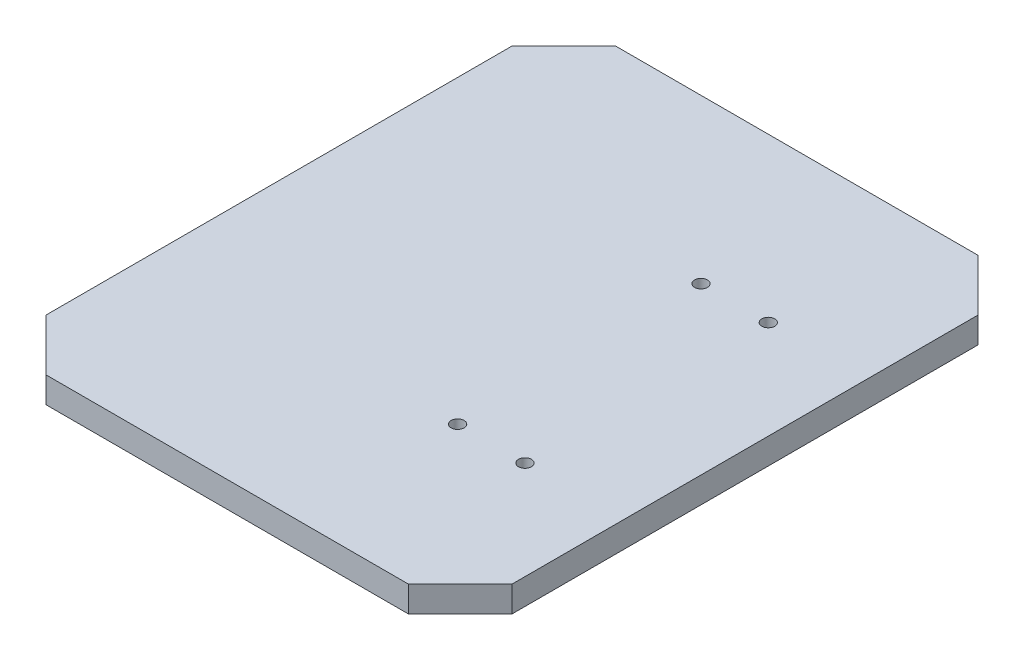
ISO-10303-21;
HEADER;
FILE_DESCRIPTION(('STEP AP214'),'2;1');
FILE_NAME('part.step','',(''),(''),'','','');
FILE_SCHEMA(('AUTOMOTIVE_DESIGN { 1 0 10303 214 1 1 1 1 }'));
ENDSEC;
DATA;
#1=APPLICATION_CONTEXT('core data for automotive mechanical design processes');
#2=APPLICATION_PROTOCOL_DEFINITION('international standard','automotive_design',2000,#1);
#3=PRODUCT_CONTEXT('',#1,'mechanical');
#4=PRODUCT('Part','Part','',(#3));
#5=PRODUCT_RELATED_PRODUCT_CATEGORY('part','',(#4));
#6=PRODUCT_DEFINITION_FORMATION('','',#4);
#7=PRODUCT_DEFINITION_CONTEXT('part definition',#1,'design');
#8=PRODUCT_DEFINITION('design','',#6,#7);
#9=PRODUCT_DEFINITION_SHAPE('','',#8);
#10=(LENGTH_UNIT() NAMED_UNIT(*) SI_UNIT(.MILLI.,.METRE.));
#11=(NAMED_UNIT(*) PLANE_ANGLE_UNIT() SI_UNIT($,.RADIAN.));
#12=(NAMED_UNIT(*) SI_UNIT($,.STERADIAN.) SOLID_ANGLE_UNIT());
#13=UNCERTAINTY_MEASURE_WITH_UNIT(LENGTH_MEASURE(1.E-05),#10,'distance_accuracy_value','');
#14=(GEOMETRIC_REPRESENTATION_CONTEXT(3) GLOBAL_UNCERTAINTY_ASSIGNED_CONTEXT((#13)) GLOBAL_UNIT_ASSIGNED_CONTEXT((#10,
#11,#12)) REPRESENTATION_CONTEXT('',''));
#15=CARTESIAN_POINT('',(0.,0.,0.));
#16=DIRECTION('',(0.,0.,1.));
#17=DIRECTION('',(1.,0.,0.));
#18=AXIS2_PLACEMENT_3D('',#15,#16,#17);
#19=CARTESIAN_POINT('',(90.,5.,0.));
#20=DIRECTION('',(0.,0.,-1.));
#21=DIRECTION('',(-1.,0.,0.));
#22=AXIS2_PLACEMENT_3D('',#19,#20,#21);
#23=PLANE('',#22);
#24=DIRECTION('',(1.,0.,0.));
#25=VECTOR('',#24,1.);
#26=CARTESIAN_POINT('',(90.,0.,0.));
#27=LINE('',#26,#25);
#28=CARTESIAN_POINT('',(10.,0.,0.));
#29=VERTEX_POINT('',#28);
#30=CARTESIAN_POINT('',(80.,0.,0.));
#31=VERTEX_POINT('',#30);
#32=EDGE_CURVE('E161',#29,#31,#27,.T.);
#33=ORIENTED_EDGE('',*,*,#32,.T.);
#34=DIRECTION('',(0.,1.,0.));
#35=VECTOR('',#34,1.);
#36=CARTESIAN_POINT('',(80.,5.,0.));
#37=LINE('',#36,#35);
#38=CARTESIAN_POINT('',(80.,5.,0.));
#39=VERTEX_POINT('',#38);
#40=EDGE_CURVE('E11',#31,#39,#37,.T.);
#41=ORIENTED_EDGE('',*,*,#40,.T.);
#42=DIRECTION('',(1.,0.,0.));
#43=VECTOR('',#42,1.);
#44=CARTESIAN_POINT('',(90.,5.,0.));
#45=LINE('',#44,#43);
#46=CARTESIAN_POINT('',(10.,5.,0.));
#47=VERTEX_POINT('',#46);
#48=EDGE_CURVE('E129',#47,#39,#45,.T.);
#49=ORIENTED_EDGE('',*,*,#48,.F.);
#50=DIRECTION('',(0.,-1.,0.));
#51=VECTOR('',#50,1.);
#52=CARTESIAN_POINT('',(10.,5.,0.));
#53=LINE('',#52,#51);
#54=EDGE_CURVE('E45',#47,#29,#53,.T.);
#55=ORIENTED_EDGE('',*,*,#54,.T.);
#56=EDGE_LOOP('',(#33,#41,#49,#55));
#57=FACE_BOUND('',#56,.T.);
#58=ADVANCED_FACE('F37',(#57),#23,.F.);
#59=CARTESIAN_POINT('',(90.,5.,-110.));
#60=DIRECTION('',(-1.,0.,0.));
#61=DIRECTION('',(0.,0.,1.));
#62=AXIS2_PLACEMENT_3D('',#59,#60,#61);
#63=PLANE('',#62);
#64=DIRECTION('',(0.,0.,-1.));
#65=VECTOR('',#64,1.);
#66=CARTESIAN_POINT('',(90.,0.,-110.));
#67=LINE('',#66,#65);
#68=CARTESIAN_POINT('',(90.,0.,-10.));
#69=VERTEX_POINT('',#68);
#70=CARTESIAN_POINT('',(90.,0.,-100.));
#71=VERTEX_POINT('',#70);
#72=EDGE_CURVE('E134',#69,#71,#67,.T.);
#73=ORIENTED_EDGE('',*,*,#72,.T.);
#74=DIRECTION('',(0.,1.,0.));
#75=VECTOR('',#74,1.);
#76=CARTESIAN_POINT('',(90.,5.,-100.));
#77=LINE('',#76,#75);
#78=CARTESIAN_POINT('',(90.,5.,-100.));
#79=VERTEX_POINT('',#78);
#80=EDGE_CURVE('E52',#71,#79,#77,.T.);
#81=ORIENTED_EDGE('',*,*,#80,.T.);
#82=DIRECTION('',(0.,0.,-1.));
#83=VECTOR('',#82,1.);
#84=CARTESIAN_POINT('',(90.,5.,-110.));
#85=LINE('',#84,#83);
#86=CARTESIAN_POINT('',(90.,5.,-10.));
#87=VERTEX_POINT('',#86);
#88=EDGE_CURVE('E132',#87,#79,#85,.T.);
#89=ORIENTED_EDGE('',*,*,#88,.F.);
#90=DIRECTION('',(0.,-1.,0.));
#91=VECTOR('',#90,1.);
#92=CARTESIAN_POINT('',(90.,5.,-10.));
#93=LINE('',#92,#91);
#94=EDGE_CURVE('E153',#87,#69,#93,.T.);
#95=ORIENTED_EDGE('',*,*,#94,.T.);
#96=EDGE_LOOP('',(#73,#81,#89,#95));
#97=FACE_BOUND('',#96,.T.);
#98=ADVANCED_FACE('F226',(#97),#63,.F.);
#99=CARTESIAN_POINT('',(0.,5.,-110.));
#100=DIRECTION('',(0.,0.,1.));
#101=DIRECTION('',(1.,0.,0.));
#102=AXIS2_PLACEMENT_3D('',#99,#100,#101);
#103=PLANE('',#102);
#104=DIRECTION('',(-1.,0.,0.));
#105=VECTOR('',#104,1.);
#106=CARTESIAN_POINT('',(0.,0.,-110.));
#107=LINE('',#106,#105);
#108=CARTESIAN_POINT('',(79.9999999999999,0.,-110.));
#109=VERTEX_POINT('',#108);
#110=CARTESIAN_POINT('',(10.,0.,-110.));
#111=VERTEX_POINT('',#110);
#112=EDGE_CURVE('E130',#109,#111,#107,.T.);
#113=ORIENTED_EDGE('',*,*,#112,.T.);
#114=DIRECTION('',(0.,1.,0.));
#115=VECTOR('',#114,1.);
#116=CARTESIAN_POINT('',(10.,5.,-110.));
#117=LINE('',#116,#115);
#118=CARTESIAN_POINT('',(10.,5.,-110.));
#119=VERTEX_POINT('',#118);
#120=EDGE_CURVE('E108',#111,#119,#117,.T.);
#121=ORIENTED_EDGE('',*,*,#120,.T.);
#122=DIRECTION('',(-1.,0.,0.));
#123=VECTOR('',#122,1.);
#124=CARTESIAN_POINT('',(0.,5.,-110.));
#125=LINE('',#124,#123);
#126=CARTESIAN_POINT('',(79.9999999999999,5.,-110.));
#127=VERTEX_POINT('',#126);
#128=EDGE_CURVE('E173',#127,#119,#125,.T.);
#129=ORIENTED_EDGE('',*,*,#128,.F.);
#130=DIRECTION('',(0.,-1.,0.));
#131=VECTOR('',#130,1.);
#132=CARTESIAN_POINT('',(80.,5.,-110.));
#133=LINE('',#132,#131);
#134=EDGE_CURVE('E113',#127,#109,#133,.T.);
#135=ORIENTED_EDGE('',*,*,#134,.T.);
#136=EDGE_LOOP('',(#113,#121,#129,#135));
#137=FACE_BOUND('',#136,.T.);
#138=ADVANCED_FACE('F231',(#137),#103,.F.);
#139=CARTESIAN_POINT('',(0.,5.,0.));
#140=DIRECTION('',(1.,0.,0.));
#141=DIRECTION('',(0.,0.,-1.));
#142=AXIS2_PLACEMENT_3D('',#139,#140,#141);
#143=PLANE('',#142);
#144=DIRECTION('',(0.,0.,1.));
#145=VECTOR('',#144,1.);
#146=CARTESIAN_POINT('',(0.,5.,0.));
#147=LINE('',#146,#145);
#148=CARTESIAN_POINT('',(0.,5.,-100.));
#149=VERTEX_POINT('',#148);
#150=CARTESIAN_POINT('',(0.,5.,-10.));
#151=VERTEX_POINT('',#150);
#152=EDGE_CURVE('E123',#149,#151,#147,.T.);
#153=ORIENTED_EDGE('',*,*,#152,.F.);
#154=DIRECTION('',(0.,-1.,0.));
#155=VECTOR('',#154,1.);
#156=CARTESIAN_POINT('',(0.,5.,-100.));
#157=LINE('',#156,#155);
#158=CARTESIAN_POINT('',(0.,0.,-100.));
#159=VERTEX_POINT('',#158);
#160=EDGE_CURVE('E107',#149,#159,#157,.T.);
#161=ORIENTED_EDGE('',*,*,#160,.T.);
#162=DIRECTION('',(0.,0.,1.));
#163=VECTOR('',#162,1.);
#164=CARTESIAN_POINT('',(0.,0.,0.));
#165=LINE('',#164,#163);
#166=CARTESIAN_POINT('',(0.,0.,-10.));
#167=VERTEX_POINT('',#166);
#168=EDGE_CURVE('E120',#159,#167,#165,.T.);
#169=ORIENTED_EDGE('',*,*,#168,.T.);
#170=DIRECTION('',(0.,1.,0.));
#171=VECTOR('',#170,1.);
#172=CARTESIAN_POINT('',(0.,5.,-10.));
#173=LINE('',#172,#171);
#174=EDGE_CURVE('E125',#167,#151,#173,.T.);
#175=ORIENTED_EDGE('',*,*,#174,.T.);
#176=EDGE_LOOP('',(#153,#161,#169,#175));
#177=FACE_BOUND('',#176,.T.);
#178=ADVANCED_FACE('F119',(#177),#143,.F.);
#179=CARTESIAN_POINT('',(0.,5.,0.));
#180=DIRECTION('',(0.,-1.,0.));
#181=DIRECTION('',(0.,0.,-1.));
#182=AXIS2_PLACEMENT_3D('',#179,#180,#181);
#183=PLANE('',#182);
#184=CARTESIAN_POINT('',(58.,5.,-78.5));
#185=DIRECTION('',(0.,-1.,0.));
#186=DIRECTION('',(0.,0.,-1.));
#187=AXIS2_PLACEMENT_3D('',#184,#185,#186);
#188=CIRCLE('',#187,1.25);
#189=CARTESIAN_POINT('',(58.,5.,-79.75));
#190=VERTEX_POINT('',#189);
#191=EDGE_CURVE('E191',#190,#190,#188,.T.);
#192=ORIENTED_EDGE('',*,*,#191,.T.);
#193=EDGE_LOOP('',(#192));
#194=FACE_BOUND('',#193,.T.);
#195=CARTESIAN_POINT('',(58.,5.,-31.5));
#196=DIRECTION('',(0.,-1.,0.));
#197=DIRECTION('',(0.,0.,-1.));
#198=AXIS2_PLACEMENT_3D('',#195,#196,#197);
#199=CIRCLE('',#198,1.25);
#200=CARTESIAN_POINT('',(58.,5.,-32.75));
#201=VERTEX_POINT('',#200);
#202=EDGE_CURVE('E185',#201,#201,#199,.T.);
#203=ORIENTED_EDGE('',*,*,#202,.T.);
#204=EDGE_LOOP('',(#203));
#205=FACE_BOUND('',#204,.T.);
#206=CARTESIAN_POINT('',(71.,5.,-31.5));
#207=DIRECTION('',(0.,-1.,0.));
#208=DIRECTION('',(0.,0.,-1.));
#209=AXIS2_PLACEMENT_3D('',#206,#207,#208);
#210=CIRCLE('',#209,1.25);
#211=CARTESIAN_POINT('',(71.,5.,-32.75));
#212=VERTEX_POINT('',#211);
#213=EDGE_CURVE('E179',#212,#212,#210,.T.);
#214=ORIENTED_EDGE('',*,*,#213,.T.);
#215=EDGE_LOOP('',(#214));
#216=FACE_BOUND('',#215,.T.);
#217=CARTESIAN_POINT('',(71.,5.,-78.5));
#218=DIRECTION('',(0.,-1.,0.));
#219=DIRECTION('',(0.,0.,-1.));
#220=AXIS2_PLACEMENT_3D('',#217,#218,#219);
#221=CIRCLE('',#220,1.25);
#222=CARTESIAN_POINT('',(71.,5.,-79.75));
#223=VERTEX_POINT('',#222);
#224=EDGE_CURVE('E166',#223,#223,#221,.T.);
#225=ORIENTED_EDGE('',*,*,#224,.T.);
#226=EDGE_LOOP('',(#225));
#227=FACE_BOUND('',#226,.T.);
#228=ORIENTED_EDGE('',*,*,#128,.T.);
#229=DIRECTION('',(0.707106781186548,0.,-0.707106781186548));
#230=VECTOR('',#229,1.);
#231=CARTESIAN_POINT('',(0.,5.,-100.));
#232=LINE('',#231,#230);
#233=EDGE_CURVE('E151',#119,#149,#232,.F.);
#234=ORIENTED_EDGE('',*,*,#233,.T.);
#235=ORIENTED_EDGE('',*,*,#152,.T.);
#236=DIRECTION('',(-0.707106781186548,0.,-0.707106781186548));
#237=VECTOR('',#236,1.);
#238=CARTESIAN_POINT('',(10.,5.,0.));
#239=LINE('',#238,#237);
#240=EDGE_CURVE('E146',#151,#47,#239,.F.);
#241=ORIENTED_EDGE('',*,*,#240,.T.);
#242=ORIENTED_EDGE('',*,*,#48,.T.);
#243=DIRECTION('',(-0.707106781186547,0.,0.707106781186548));
#244=VECTOR('',#243,1.);
#245=CARTESIAN_POINT('',(90.,5.,-10.));
#246=LINE('',#245,#244);
#247=EDGE_CURVE('E59',#39,#87,#246,.F.);
#248=ORIENTED_EDGE('',*,*,#247,.T.);
#249=ORIENTED_EDGE('',*,*,#88,.T.);
#250=DIRECTION('',(0.707106781186548,0.,0.707106781186548));
#251=VECTOR('',#250,1.);
#252=CARTESIAN_POINT('',(80.,5.,-110.));
#253=LINE('',#252,#251);
#254=EDGE_CURVE('E149',#79,#127,#253,.F.);
#255=ORIENTED_EDGE('',*,*,#254,.T.);
#256=EDGE_LOOP('',(#228,#234,#235,#241,#242,#248,#249,#255));
#257=FACE_BOUND('',#256,.T.);
#258=ADVANCED_FACE('F202',(#194,#205,#216,#227,#257),#183,.F.);
#259=CARTESIAN_POINT('',(0.,0.,0.));
#260=DIRECTION('',(0.,-1.,0.));
#261=DIRECTION('',(0.,0.,-1.));
#262=AXIS2_PLACEMENT_3D('',#259,#260,#261);
#263=PLANE('',#262);
#264=CARTESIAN_POINT('',(58.,0.,-78.5));
#265=DIRECTION('',(0.,-1.,0.));
#266=DIRECTION('',(0.,0.,-1.));
#267=AXIS2_PLACEMENT_3D('',#264,#265,#266);
#268=CIRCLE('',#267,1.25);
#269=CARTESIAN_POINT('',(58.,0.,-79.75));
#270=VERTEX_POINT('',#269);
#271=EDGE_CURVE('E194',#270,#270,#268,.T.);
#272=ORIENTED_EDGE('',*,*,#271,.F.);
#273=EDGE_LOOP('',(#272));
#274=FACE_BOUND('',#273,.T.);
#275=CARTESIAN_POINT('',(58.,0.,-31.5));
#276=DIRECTION('',(0.,-1.,0.));
#277=DIRECTION('',(0.,0.,-1.));
#278=AXIS2_PLACEMENT_3D('',#275,#276,#277);
#279=CIRCLE('',#278,1.25);
#280=CARTESIAN_POINT('',(58.,0.,-32.75));
#281=VERTEX_POINT('',#280);
#282=EDGE_CURVE('E188',#281,#281,#279,.T.);
#283=ORIENTED_EDGE('',*,*,#282,.F.);
#284=EDGE_LOOP('',(#283));
#285=FACE_BOUND('',#284,.T.);
#286=CARTESIAN_POINT('',(71.,0.,-31.5));
#287=DIRECTION('',(0.,-1.,0.));
#288=DIRECTION('',(0.,0.,-1.));
#289=AXIS2_PLACEMENT_3D('',#286,#287,#288);
#290=CIRCLE('',#289,1.25);
#291=CARTESIAN_POINT('',(71.,0.,-32.75));
#292=VERTEX_POINT('',#291);
#293=EDGE_CURVE('E182',#292,#292,#290,.T.);
#294=ORIENTED_EDGE('',*,*,#293,.F.);
#295=EDGE_LOOP('',(#294));
#296=FACE_BOUND('',#295,.T.);
#297=CARTESIAN_POINT('',(71.,0.,-78.5));
#298=DIRECTION('',(0.,-1.,0.));
#299=DIRECTION('',(0.,0.,-1.));
#300=AXIS2_PLACEMENT_3D('',#297,#298,#299);
#301=CIRCLE('',#300,1.25);
#302=CARTESIAN_POINT('',(71.,0.,-79.75));
#303=VERTEX_POINT('',#302);
#304=EDGE_CURVE('E169',#303,#303,#301,.T.);
#305=ORIENTED_EDGE('',*,*,#304,.F.);
#306=EDGE_LOOP('',(#305));
#307=FACE_BOUND('',#306,.T.);
#308=ORIENTED_EDGE('',*,*,#168,.F.);
#309=DIRECTION('',(-0.707106781186548,0.,0.707106781186548));
#310=VECTOR('',#309,1.);
#311=CARTESIAN_POINT('',(-50.,0.,-50.));
#312=LINE('',#311,#310);
#313=EDGE_CURVE('E103',#159,#111,#312,.F.);
#314=ORIENTED_EDGE('',*,*,#313,.T.);
#315=ORIENTED_EDGE('',*,*,#112,.F.);
#316=DIRECTION('',(-0.707106781186548,0.,-0.707106781186548));
#317=VECTOR('',#316,1.);
#318=CARTESIAN_POINT('',(95.,0.,-95.));
#319=LINE('',#318,#317);
#320=EDGE_CURVE('E114',#109,#71,#319,.F.);
#321=ORIENTED_EDGE('',*,*,#320,.T.);
#322=ORIENTED_EDGE('',*,*,#72,.F.);
#323=DIRECTION('',(0.707106781186547,0.,-0.707106781186548));
#324=VECTOR('',#323,1.);
#325=CARTESIAN_POINT('',(40.,0.,40.));
#326=LINE('',#325,#324);
#327=EDGE_CURVE('E140',#69,#31,#326,.F.);
#328=ORIENTED_EDGE('',*,*,#327,.T.);
#329=ORIENTED_EDGE('',*,*,#32,.F.);
#330=DIRECTION('',(0.707106781186548,0.,0.707106781186548));
#331=VECTOR('',#330,1.);
#332=CARTESIAN_POINT('',(5.00000000000001,0.,-5.00000000000001));
#333=LINE('',#332,#331);
#334=EDGE_CURVE('E124',#29,#167,#333,.F.);
#335=ORIENTED_EDGE('',*,*,#334,.T.);
#336=EDGE_LOOP('',(#308,#314,#315,#321,#322,#328,#329,#335));
#337=FACE_BOUND('',#336,.T.);
#338=ADVANCED_FACE('F127',(#274,#285,#296,#307,#337),#263,.T.);
#339=CARTESIAN_POINT('',(0.,5.,-100.));
#340=DIRECTION('',(0.707106781186547,0.,0.707106781186547));
#341=DIRECTION('',(0.,-1.,0.));
#342=AXIS2_PLACEMENT_3D('',#339,#340,#341);
#343=PLANE('',#342);
#344=ORIENTED_EDGE('',*,*,#233,.F.);
#345=ORIENTED_EDGE('',*,*,#120,.F.);
#346=ORIENTED_EDGE('',*,*,#313,.F.);
#347=ORIENTED_EDGE('',*,*,#160,.F.);
#348=EDGE_LOOP('',(#344,#345,#346,#347));
#349=FACE_BOUND('',#348,.T.);
#350=ADVANCED_FACE('F106',(#349),#343,.F.);
#351=CARTESIAN_POINT('',(80.,5.,-110.));
#352=DIRECTION('',(-0.707106781186548,0.,0.707106781186548));
#353=DIRECTION('',(0.,-1.,0.));
#354=AXIS2_PLACEMENT_3D('',#351,#352,#353);
#355=PLANE('',#354);
#356=ORIENTED_EDGE('',*,*,#254,.F.);
#357=ORIENTED_EDGE('',*,*,#80,.F.);
#358=ORIENTED_EDGE('',*,*,#320,.F.);
#359=ORIENTED_EDGE('',*,*,#134,.F.);
#360=EDGE_LOOP('',(#356,#357,#358,#359));
#361=FACE_BOUND('',#360,.T.);
#362=ADVANCED_FACE('F237',(#361),#355,.F.);
#363=CARTESIAN_POINT('',(90.,5.,-10.));
#364=DIRECTION('',(-0.707106781186548,0.,-0.707106781186547));
#365=DIRECTION('',(0.,-1.,0.));
#366=AXIS2_PLACEMENT_3D('',#363,#364,#365);
#367=PLANE('',#366);
#368=ORIENTED_EDGE('',*,*,#247,.F.);
#369=ORIENTED_EDGE('',*,*,#40,.F.);
#370=ORIENTED_EDGE('',*,*,#327,.F.);
#371=ORIENTED_EDGE('',*,*,#94,.F.);
#372=EDGE_LOOP('',(#368,#369,#370,#371));
#373=FACE_BOUND('',#372,.T.);
#374=ADVANCED_FACE('F222',(#373),#367,.F.);
#375=CARTESIAN_POINT('',(10.,5.,0.));
#376=DIRECTION('',(0.707106781186548,0.,-0.707106781186548));
#377=DIRECTION('',(0.,-1.,0.));
#378=AXIS2_PLACEMENT_3D('',#375,#376,#377);
#379=PLANE('',#378);
#380=ORIENTED_EDGE('',*,*,#240,.F.);
#381=ORIENTED_EDGE('',*,*,#174,.F.);
#382=ORIENTED_EDGE('',*,*,#334,.F.);
#383=ORIENTED_EDGE('',*,*,#54,.F.);
#384=EDGE_LOOP('',(#380,#381,#382,#383));
#385=FACE_BOUND('',#384,.T.);
#386=ADVANCED_FACE('F39',(#385),#379,.F.);
#387=CARTESIAN_POINT('',(71.,0.,-78.5));
#388=DIRECTION('',(0.,-1.,0.));
#389=DIRECTION('',(0.,0.,-1.));
#390=AXIS2_PLACEMENT_3D('',#387,#388,#389);
#391=CYLINDRICAL_SURFACE('',#390,1.25);
#392=ORIENTED_EDGE('',*,*,#224,.F.);
#393=EDGE_LOOP('',(#392));
#394=FACE_BOUND('',#393,.T.);
#395=ORIENTED_EDGE('',*,*,#304,.T.);
#396=EDGE_LOOP('',(#395));
#397=FACE_BOUND('',#396,.T.);
#398=ADVANCED_FACE('F210',(#394,#397),#391,.F.);
#399=CARTESIAN_POINT('',(71.,0.,-31.5));
#400=DIRECTION('',(0.,-1.,0.));
#401=DIRECTION('',(0.,0.,-1.));
#402=AXIS2_PLACEMENT_3D('',#399,#400,#401);
#403=CYLINDRICAL_SURFACE('',#402,1.25);
#404=ORIENTED_EDGE('',*,*,#213,.F.);
#405=EDGE_LOOP('',(#404));
#406=FACE_BOUND('',#405,.T.);
#407=ORIENTED_EDGE('',*,*,#293,.T.);
#408=EDGE_LOOP('',(#407));
#409=FACE_BOUND('',#408,.T.);
#410=ADVANCED_FACE('F212',(#406,#409),#403,.F.);
#411=CARTESIAN_POINT('',(58.,0.,-31.5));
#412=DIRECTION('',(0.,-1.,0.));
#413=DIRECTION('',(0.,0.,-1.));
#414=AXIS2_PLACEMENT_3D('',#411,#412,#413);
#415=CYLINDRICAL_SURFACE('',#414,1.25);
#416=ORIENTED_EDGE('',*,*,#202,.F.);
#417=EDGE_LOOP('',(#416));
#418=FACE_BOUND('',#417,.T.);
#419=ORIENTED_EDGE('',*,*,#282,.T.);
#420=EDGE_LOOP('',(#419));
#421=FACE_BOUND('',#420,.T.);
#422=ADVANCED_FACE('F219',(#418,#421),#415,.F.);
#423=CARTESIAN_POINT('',(58.,0.,-78.5));
#424=DIRECTION('',(0.,-1.,0.));
#425=DIRECTION('',(0.,0.,-1.));
#426=AXIS2_PLACEMENT_3D('',#423,#424,#425);
#427=CYLINDRICAL_SURFACE('',#426,1.25);
#428=ORIENTED_EDGE('',*,*,#191,.F.);
#429=EDGE_LOOP('',(#428));
#430=FACE_BOUND('',#429,.T.);
#431=ORIENTED_EDGE('',*,*,#271,.T.);
#432=EDGE_LOOP('',(#431));
#433=FACE_BOUND('',#432,.T.);
#434=ADVANCED_FACE('F198',(#430,#433),#427,.F.);
#435=CLOSED_SHELL('',(#58,#98,#138,#178,#258,#338,#350,#362,#374,#386,#398,#410,#422,#434));
#436=MANIFOLD_SOLID_BREP('B2',#435);
#437=ADVANCED_BREP_SHAPE_REPRESENTATION('',(#18,#436),#14);
#438=SHAPE_DEFINITION_REPRESENTATION(#9,#437);
ENDSEC;
END-ISO-10303-21;
